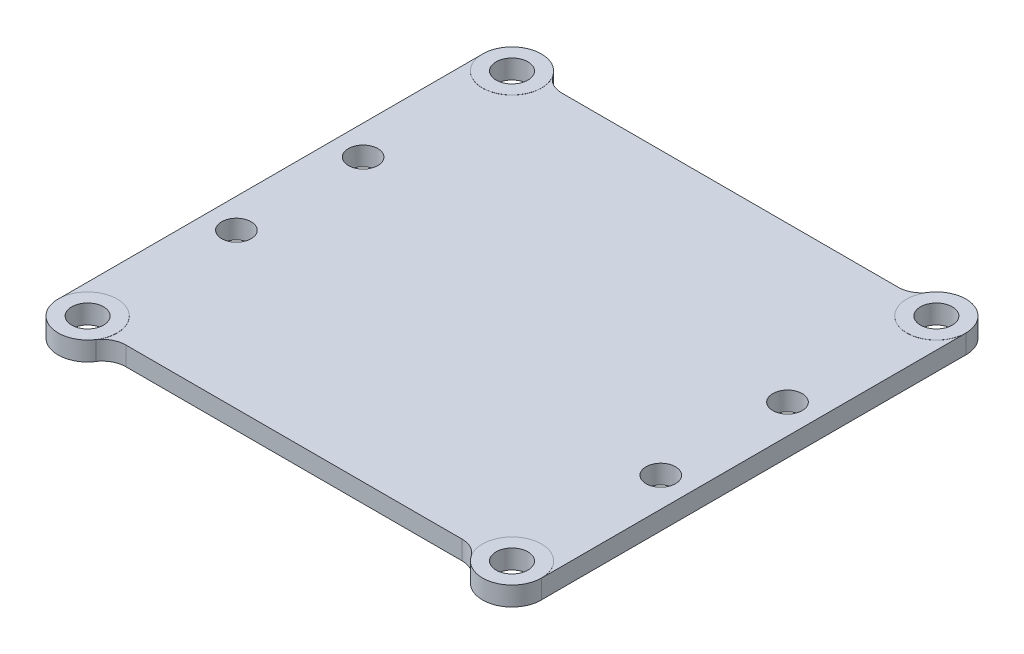
ISO-10303-21;
HEADER;
FILE_DESCRIPTION(('STEP AP214'),'2;1');
FILE_NAME('part.step','',(''),(''),'','','');
FILE_SCHEMA(('AUTOMOTIVE_DESIGN { 1 0 10303 214 1 1 1 1 }'));
ENDSEC;
DATA;
#1=APPLICATION_CONTEXT('core data for automotive mechanical design processes');
#2=APPLICATION_PROTOCOL_DEFINITION('international standard','automotive_design',2000,#1);
#3=PRODUCT_CONTEXT('',#1,'mechanical');
#4=PRODUCT('Part','Part','',(#3));
#5=PRODUCT_RELATED_PRODUCT_CATEGORY('part','',(#4));
#6=PRODUCT_DEFINITION_FORMATION('','',#4);
#7=PRODUCT_DEFINITION_CONTEXT('part definition',#1,'design');
#8=PRODUCT_DEFINITION('design','',#6,#7);
#9=PRODUCT_DEFINITION_SHAPE('','',#8);
#10=(LENGTH_UNIT() NAMED_UNIT(*) SI_UNIT(.MILLI.,.METRE.));
#11=(NAMED_UNIT(*) PLANE_ANGLE_UNIT() SI_UNIT($,.RADIAN.));
#12=(NAMED_UNIT(*) SI_UNIT($,.STERADIAN.) SOLID_ANGLE_UNIT());
#13=UNCERTAINTY_MEASURE_WITH_UNIT(LENGTH_MEASURE(1.E-05),#10,'distance_accuracy_value','');
#14=(GEOMETRIC_REPRESENTATION_CONTEXT(3) GLOBAL_UNCERTAINTY_ASSIGNED_CONTEXT((#13)) GLOBAL_UNIT_ASSIGNED_CONTEXT((#10,
#11,#12)) REPRESENTATION_CONTEXT('',''));
#15=CARTESIAN_POINT('',(0.,0.,0.));
#16=DIRECTION('',(0.,0.,1.));
#17=DIRECTION('',(1.,0.,0.));
#18=AXIS2_PLACEMENT_3D('',#15,#16,#17);
#19=CARTESIAN_POINT('',(0.,1.61,0.));
#20=DIRECTION('',(0.,1.,0.));
#21=DIRECTION('',(0.,0.,1.));
#22=AXIS2_PLACEMENT_3D('',#19,#20,#21);
#23=PLANE('',#22);
#24=CARTESIAN_POINT('',(-18.,1.61,18.));
#25=DIRECTION('',(0.,1.,0.));
#26=DIRECTION('',(0.,0.,1.));
#27=AXIS2_PLACEMENT_3D('',#24,#25,#26);
#28=CIRCLE('',#27,1.35);
#29=CARTESIAN_POINT('',(-18.,1.61,19.35));
#30=VERTEX_POINT('',#29);
#31=EDGE_CURVE('E239',#30,#30,#28,.F.);
#32=ORIENTED_EDGE('',*,*,#31,.T.);
#33=EDGE_LOOP('',(#32));
#34=FACE_BOUND('',#33,.T.);
#35=CARTESIAN_POINT('',(-18.,1.61,18.));
#36=DIRECTION('',(0.,1.,0.));
#37=DIRECTION('',(0.,0.,1.));
#38=AXIS2_PLACEMENT_3D('',#35,#36,#37);
#39=CIRCLE('',#38,2.5);
#40=CARTESIAN_POINT('',(-18.,1.61,20.5));
#41=VERTEX_POINT('',#40);
#42=EDGE_CURVE('E230',#41,#41,#39,.F.);
#43=ORIENTED_EDGE('',*,*,#42,.F.);
#44=EDGE_LOOP('',(#43));
#45=FACE_BOUND('',#44,.T.);
#46=ADVANCED_FACE('F17',(#34,#45),#23,.T.);
#47=CARTESIAN_POINT('',(0.,1.61,0.));
#48=DIRECTION('',(0.,1.,0.));
#49=DIRECTION('',(0.,0.,1.));
#50=AXIS2_PLACEMENT_3D('',#47,#48,#49);
#51=PLANE('',#50);
#52=CARTESIAN_POINT('',(18.,1.61,18.));
#53=DIRECTION('',(0.,1.,0.));
#54=DIRECTION('',(0.,0.,1.));
#55=AXIS2_PLACEMENT_3D('',#52,#53,#54);
#56=CIRCLE('',#55,1.35);
#57=CARTESIAN_POINT('',(18.,1.61,19.35));
#58=VERTEX_POINT('',#57);
#59=EDGE_CURVE('E237',#58,#58,#56,.F.);
#60=ORIENTED_EDGE('',*,*,#59,.T.);
#61=EDGE_LOOP('',(#60));
#62=FACE_BOUND('',#61,.T.);
#63=CARTESIAN_POINT('',(18.,1.61,18.));
#64=DIRECTION('',(0.,1.,0.));
#65=DIRECTION('',(0.,0.,1.));
#66=AXIS2_PLACEMENT_3D('',#63,#64,#65);
#67=CIRCLE('',#66,2.5);
#68=CARTESIAN_POINT('',(18.,1.61,20.5));
#69=VERTEX_POINT('',#68);
#70=EDGE_CURVE('E225',#69,#69,#67,.F.);
#71=ORIENTED_EDGE('',*,*,#70,.F.);
#72=EDGE_LOOP('',(#71));
#73=FACE_BOUND('',#72,.T.);
#74=ADVANCED_FACE('F281',(#62,#73),#51,.T.);
#75=CARTESIAN_POINT('',(0.,1.61,0.));
#76=DIRECTION('',(0.,1.,0.));
#77=DIRECTION('',(0.,0.,1.));
#78=AXIS2_PLACEMENT_3D('',#75,#76,#77);
#79=PLANE('',#78);
#80=CARTESIAN_POINT('',(18.,1.61,-18.));
#81=DIRECTION('',(0.,1.,0.));
#82=DIRECTION('',(0.,0.,1.));
#83=AXIS2_PLACEMENT_3D('',#80,#81,#82);
#84=CIRCLE('',#83,1.35);
#85=CARTESIAN_POINT('',(18.,1.61,-16.65));
#86=VERTEX_POINT('',#85);
#87=EDGE_CURVE('E234',#86,#86,#84,.F.);
#88=ORIENTED_EDGE('',*,*,#87,.T.);
#89=EDGE_LOOP('',(#88));
#90=FACE_BOUND('',#89,.T.);
#91=CARTESIAN_POINT('',(18.,1.61,-18.));
#92=DIRECTION('',(0.,-1.,0.));
#93=DIRECTION('',(0.,0.,-1.));
#94=AXIS2_PLACEMENT_3D('',#91,#92,#93);
#95=CIRCLE('',#94,2.5);
#96=CARTESIAN_POINT('',(18.,1.61,-20.5));
#97=VERTEX_POINT('',#96);
#98=EDGE_CURVE('E120',#97,#97,#95,.T.);
#99=ORIENTED_EDGE('',*,*,#98,.F.);
#100=EDGE_LOOP('',(#99));
#101=FACE_BOUND('',#100,.T.);
#102=ADVANCED_FACE('F275',(#90,#101),#79,.T.);
#103=CARTESIAN_POINT('',(0.,1.61,0.));
#104=DIRECTION('',(0.,1.,0.));
#105=DIRECTION('',(0.,0.,1.));
#106=AXIS2_PLACEMENT_3D('',#103,#104,#105);
#107=PLANE('',#106);
#108=CARTESIAN_POINT('',(-18.,1.61,-18.));
#109=DIRECTION('',(0.,1.,0.));
#110=DIRECTION('',(0.,0.,1.));
#111=AXIS2_PLACEMENT_3D('',#108,#109,#110);
#112=CIRCLE('',#111,1.35);
#113=CARTESIAN_POINT('',(-18.,1.61,-16.65));
#114=VERTEX_POINT('',#113);
#115=EDGE_CURVE('E20',#114,#114,#112,.F.);
#116=ORIENTED_EDGE('',*,*,#115,.T.);
#117=EDGE_LOOP('',(#116));
#118=FACE_BOUND('',#117,.T.);
#119=CARTESIAN_POINT('',(-18.,1.61,-18.));
#120=DIRECTION('',(0.,1.,0.));
#121=DIRECTION('',(0.,0.,1.));
#122=AXIS2_PLACEMENT_3D('',#119,#120,#121);
#123=CIRCLE('',#122,2.5);
#124=CARTESIAN_POINT('',(-18.,1.61,-15.5));
#125=VERTEX_POINT('',#124);
#126=EDGE_CURVE('E219',#125,#125,#123,.F.);
#127=ORIENTED_EDGE('',*,*,#126,.F.);
#128=EDGE_LOOP('',(#127));
#129=FACE_BOUND('',#128,.T.);
#130=ADVANCED_FACE('F246',(#118,#129),#107,.T.);
#131=CARTESIAN_POINT('',(-18.,1.6,-18.));
#132=DIRECTION('',(0.,1.,0.));
#133=DIRECTION('',(0.,0.,1.));
#134=AXIS2_PLACEMENT_3D('',#131,#132,#133);
#135=CYLINDRICAL_SURFACE('',#134,1.35);
#136=ORIENTED_EDGE('',*,*,#115,.F.);
#137=EDGE_LOOP('',(#136));
#138=FACE_BOUND('',#137,.T.);
#139=CARTESIAN_POINT('',(-18.,-0.01,-18.));
#140=DIRECTION('',(0.,1.,0.));
#141=DIRECTION('',(0.,0.,1.));
#142=AXIS2_PLACEMENT_3D('',#139,#140,#141);
#143=CIRCLE('',#142,1.35);
#144=CARTESIAN_POINT('',(-18.,-0.01,-16.65));
#145=VERTEX_POINT('',#144);
#146=EDGE_CURVE('E215',#145,#145,#143,.T.);
#147=ORIENTED_EDGE('',*,*,#146,.F.);
#148=EDGE_LOOP('',(#147));
#149=FACE_BOUND('',#148,.T.);
#150=ADVANCED_FACE('F249',(#138,#149),#135,.F.);
#151=CARTESIAN_POINT('',(-18.,1.6,18.));
#152=DIRECTION('',(0.,1.,0.));
#153=DIRECTION('',(0.,0.,1.));
#154=AXIS2_PLACEMENT_3D('',#151,#152,#153);
#155=CYLINDRICAL_SURFACE('',#154,1.35);
#156=ORIENTED_EDGE('',*,*,#31,.F.);
#157=EDGE_LOOP('',(#156));
#158=FACE_BOUND('',#157,.T.);
#159=CARTESIAN_POINT('',(-18.,-0.01,18.));
#160=DIRECTION('',(0.,1.,0.));
#161=DIRECTION('',(0.,0.,1.));
#162=AXIS2_PLACEMENT_3D('',#159,#160,#161);
#163=CIRCLE('',#162,1.35);
#164=CARTESIAN_POINT('',(-18.,-0.01,19.35));
#165=VERTEX_POINT('',#164);
#166=EDGE_CURVE('E212',#165,#165,#163,.T.);
#167=ORIENTED_EDGE('',*,*,#166,.F.);
#168=EDGE_LOOP('',(#167));
#169=FACE_BOUND('',#168,.T.);
#170=ADVANCED_FACE('F252',(#158,#169),#155,.F.);
#171=CARTESIAN_POINT('',(18.,1.6,18.));
#172=DIRECTION('',(0.,1.,0.));
#173=DIRECTION('',(0.,0.,1.));
#174=AXIS2_PLACEMENT_3D('',#171,#172,#173);
#175=CYLINDRICAL_SURFACE('',#174,1.35);
#176=ORIENTED_EDGE('',*,*,#59,.F.);
#177=EDGE_LOOP('',(#176));
#178=FACE_BOUND('',#177,.T.);
#179=CARTESIAN_POINT('',(18.,-0.01,18.));
#180=DIRECTION('',(0.,1.,0.));
#181=DIRECTION('',(0.,0.,1.));
#182=AXIS2_PLACEMENT_3D('',#179,#180,#181);
#183=CIRCLE('',#182,1.35);
#184=CARTESIAN_POINT('',(18.,-0.01,19.35));
#185=VERTEX_POINT('',#184);
#186=EDGE_CURVE('E209',#185,#185,#183,.T.);
#187=ORIENTED_EDGE('',*,*,#186,.F.);
#188=EDGE_LOOP('',(#187));
#189=FACE_BOUND('',#188,.T.);
#190=ADVANCED_FACE('F363',(#178,#189),#175,.F.);
#191=CARTESIAN_POINT('',(18.,1.6,-18.));
#192=DIRECTION('',(0.,1.,0.));
#193=DIRECTION('',(0.,0.,1.));
#194=AXIS2_PLACEMENT_3D('',#191,#192,#193);
#195=CYLINDRICAL_SURFACE('',#194,1.35);
#196=ORIENTED_EDGE('',*,*,#87,.F.);
#197=EDGE_LOOP('',(#196));
#198=FACE_BOUND('',#197,.T.);
#199=CARTESIAN_POINT('',(18.,-0.01,-18.));
#200=DIRECTION('',(0.,1.,0.));
#201=DIRECTION('',(0.,0.,1.));
#202=AXIS2_PLACEMENT_3D('',#199,#200,#201);
#203=CIRCLE('',#202,1.35);
#204=CARTESIAN_POINT('',(18.,-0.01,-16.65));
#205=VERTEX_POINT('',#204);
#206=EDGE_CURVE('E206',#205,#205,#203,.T.);
#207=ORIENTED_EDGE('',*,*,#206,.F.);
#208=EDGE_LOOP('',(#207));
#209=FACE_BOUND('',#208,.T.);
#210=ADVANCED_FACE('F260',(#198,#209),#195,.F.);
#211=CARTESIAN_POINT('',(0.,-0.01,0.));
#212=DIRECTION('',(0.,-1.,0.));
#213=DIRECTION('',(0.,0.,-1.));
#214=AXIS2_PLACEMENT_3D('',#211,#212,#213);
#215=PLANE('',#214);
#216=ORIENTED_EDGE('',*,*,#146,.T.);
#217=EDGE_LOOP('',(#216));
#218=FACE_BOUND('',#217,.T.);
#219=CARTESIAN_POINT('',(-18.,-0.01,-18.));
#220=DIRECTION('',(0.,-1.,0.));
#221=DIRECTION('',(0.,0.,-1.));
#222=AXIS2_PLACEMENT_3D('',#219,#220,#221);
#223=CIRCLE('',#222,2.5);
#224=CARTESIAN_POINT('',(-18.,-0.01,-20.5));
#225=VERTEX_POINT('',#224);
#226=EDGE_CURVE('E187',#225,#225,#223,.F.);
#227=ORIENTED_EDGE('',*,*,#226,.F.);
#228=EDGE_LOOP('',(#227));
#229=FACE_BOUND('',#228,.T.);
#230=ADVANCED_FACE('F256',(#218,#229),#215,.T.);
#231=CARTESIAN_POINT('',(0.,-0.01,0.));
#232=DIRECTION('',(0.,-1.,0.));
#233=DIRECTION('',(0.,0.,-1.));
#234=AXIS2_PLACEMENT_3D('',#231,#232,#233);
#235=PLANE('',#234);
#236=ORIENTED_EDGE('',*,*,#166,.T.);
#237=EDGE_LOOP('',(#236));
#238=FACE_BOUND('',#237,.T.);
#239=CARTESIAN_POINT('',(-18.,-0.01,18.));
#240=DIRECTION('',(0.,1.,0.));
#241=DIRECTION('',(0.,0.,1.));
#242=AXIS2_PLACEMENT_3D('',#239,#240,#241);
#243=CIRCLE('',#242,2.5);
#244=CARTESIAN_POINT('',(-18.,-0.01,20.5));
#245=VERTEX_POINT('',#244);
#246=EDGE_CURVE('E183',#245,#245,#243,.T.);
#247=ORIENTED_EDGE('',*,*,#246,.F.);
#248=EDGE_LOOP('',(#247));
#249=FACE_BOUND('',#248,.T.);
#250=ADVANCED_FACE('F259',(#238,#249),#235,.T.);
#251=CARTESIAN_POINT('',(0.,-0.01,0.));
#252=DIRECTION('',(0.,-1.,0.));
#253=DIRECTION('',(0.,0.,-1.));
#254=AXIS2_PLACEMENT_3D('',#251,#252,#253);
#255=PLANE('',#254);
#256=ORIENTED_EDGE('',*,*,#186,.T.);
#257=EDGE_LOOP('',(#256));
#258=FACE_BOUND('',#257,.T.);
#259=CARTESIAN_POINT('',(18.,-0.01,18.));
#260=DIRECTION('',(0.,1.,0.));
#261=DIRECTION('',(0.,0.,1.));
#262=AXIS2_PLACEMENT_3D('',#259,#260,#261);
#263=CIRCLE('',#262,2.5);
#264=CARTESIAN_POINT('',(18.,-0.01,20.5));
#265=VERTEX_POINT('',#264);
#266=EDGE_CURVE('E174',#265,#265,#263,.T.);
#267=ORIENTED_EDGE('',*,*,#266,.F.);
#268=EDGE_LOOP('',(#267));
#269=FACE_BOUND('',#268,.T.);
#270=ADVANCED_FACE('F353',(#258,#269),#255,.T.);
#271=CARTESIAN_POINT('',(0.,-0.01,0.));
#272=DIRECTION('',(0.,-1.,0.));
#273=DIRECTION('',(0.,0.,-1.));
#274=AXIS2_PLACEMENT_3D('',#271,#272,#273);
#275=PLANE('',#274);
#276=ORIENTED_EDGE('',*,*,#206,.T.);
#277=EDGE_LOOP('',(#276));
#278=FACE_BOUND('',#277,.T.);
#279=CARTESIAN_POINT('',(18.,-0.01,-18.));
#280=DIRECTION('',(0.,-1.,0.));
#281=DIRECTION('',(0.,0.,-1.));
#282=AXIS2_PLACEMENT_3D('',#279,#280,#281);
#283=CIRCLE('',#282,2.5);
#284=CARTESIAN_POINT('',(18.,-0.01,-20.5));
#285=VERTEX_POINT('',#284);
#286=EDGE_CURVE('E170',#285,#285,#283,.F.);
#287=ORIENTED_EDGE('',*,*,#286,.F.);
#288=EDGE_LOOP('',(#287));
#289=FACE_BOUND('',#288,.T.);
#290=ADVANCED_FACE('F349',(#278,#289),#275,.T.);
#291=CARTESIAN_POINT('',(0.,1.6,0.));
#292=DIRECTION('',(0.,1.,0.));
#293=DIRECTION('',(0.,0.,1.));
#294=AXIS2_PLACEMENT_3D('',#291,#292,#293);
#295=PLANE('',#294);
#296=CARTESIAN_POINT('',(18.,1.6,-5.37));
#297=DIRECTION('',(0.,-1.,0.));
#298=DIRECTION('',(0.,0.,-1.));
#299=AXIS2_PLACEMENT_3D('',#296,#297,#298);
#300=CIRCLE('',#299,1.25);
#301=CARTESIAN_POINT('',(18.,1.6,-6.62));
#302=VERTEX_POINT('',#301);
#303=EDGE_CURVE('E158',#302,#302,#300,.T.);
#304=ORIENTED_EDGE('',*,*,#303,.T.);
#305=EDGE_LOOP('',(#304));
#306=FACE_BOUND('',#305,.T.);
#307=CARTESIAN_POINT('',(-18.,1.6,5.38));
#308=DIRECTION('',(0.,-1.,0.));
#309=DIRECTION('',(0.,0.,-1.));
#310=AXIS2_PLACEMENT_3D('',#307,#308,#309);
#311=CIRCLE('',#310,1.25);
#312=CARTESIAN_POINT('',(-18.,1.6,4.13));
#313=VERTEX_POINT('',#312);
#314=EDGE_CURVE('E161',#313,#313,#311,.T.);
#315=ORIENTED_EDGE('',*,*,#314,.T.);
#316=EDGE_LOOP('',(#315));
#317=FACE_BOUND('',#316,.T.);
#318=CARTESIAN_POINT('',(-18.,1.6,-5.37));
#319=DIRECTION('',(0.,-1.,0.));
#320=DIRECTION('',(0.,0.,-1.));
#321=AXIS2_PLACEMENT_3D('',#318,#319,#320);
#322=CIRCLE('',#321,1.25);
#323=CARTESIAN_POINT('',(-18.,1.6,-6.62));
#324=VERTEX_POINT('',#323);
#325=EDGE_CURVE('E164',#324,#324,#322,.T.);
#326=ORIENTED_EDGE('',*,*,#325,.T.);
#327=EDGE_LOOP('',(#326));
#328=FACE_BOUND('',#327,.T.);
#329=CARTESIAN_POINT('',(18.,1.6,5.38));
#330=DIRECTION('',(0.,-1.,0.));
#331=DIRECTION('',(0.,0.,-1.));
#332=AXIS2_PLACEMENT_3D('',#329,#330,#331);
#333=CIRCLE('',#332,1.25);
#334=CARTESIAN_POINT('',(18.,1.6,4.13));
#335=VERTEX_POINT('',#334);
#336=EDGE_CURVE('E167',#335,#335,#333,.T.);
#337=ORIENTED_EDGE('',*,*,#336,.T.);
#338=EDGE_LOOP('',(#337));
#339=FACE_BOUND('',#338,.T.);
#340=CARTESIAN_POINT('',(-14.25834261323,1.6,-20.5));
#341=DIRECTION('',(0.,-1.,0.));
#342=DIRECTION('',(0.,0.,-1.));
#343=AXIS2_PLACEMENT_3D('',#340,#341,#342);
#344=CIRCLE('',#343,2.);
#345=CARTESIAN_POINT('',(-14.25834261323,1.6,-18.5));
#346=VERTEX_POINT('',#345);
#347=CARTESIAN_POINT('',(-15.9213014517933,1.6,-19.3888888888888));
#348=VERTEX_POINT('',#347);
#349=EDGE_CURVE('E190',#346,#348,#344,.T.);
#350=ORIENTED_EDGE('',*,*,#349,.T.);
#351=CARTESIAN_POINT('',(-18.,1.6,-18.));
#352=DIRECTION('',(0.,1.,0.));
#353=DIRECTION('',(0.,0.,1.));
#354=AXIS2_PLACEMENT_3D('',#351,#352,#353);
#355=CIRCLE('',#354,2.5);
#356=CARTESIAN_POINT('',(-20.5,1.6,-18.));
#357=VERTEX_POINT('',#356);
#358=EDGE_CURVE('E197',#348,#357,#355,.F.);
#359=ORIENTED_EDGE('',*,*,#358,.T.);
#360=DIRECTION('',(0.,0.,1.));
#361=VECTOR('',#360,1.);
#362=CARTESIAN_POINT('',(-20.5,1.6,-20.5));
#363=LINE('',#362,#361);
#364=CARTESIAN_POINT('',(-20.5,1.6,18.));
#365=VERTEX_POINT('',#364);
#366=EDGE_CURVE('E186',#365,#357,#363,.F.);
#367=ORIENTED_EDGE('',*,*,#366,.F.);
#368=CARTESIAN_POINT('',(-18.,1.6,18.));
#369=DIRECTION('',(0.,1.,0.));
#370=DIRECTION('',(0.,0.,1.));
#371=AXIS2_PLACEMENT_3D('',#368,#369,#370);
#372=CIRCLE('',#371,2.5);
#373=CARTESIAN_POINT('',(-15.9213014517933,1.6,19.3888888888888));
#374=VERTEX_POINT('',#373);
#375=EDGE_CURVE('E203',#365,#374,#372,.F.);
#376=ORIENTED_EDGE('',*,*,#375,.T.);
#377=CARTESIAN_POINT('',(-14.25834261323,1.6,20.5));
#378=DIRECTION('',(0.,1.,0.));
#379=DIRECTION('',(0.,0.,1.));
#380=AXIS2_PLACEMENT_3D('',#377,#378,#379);
#381=CIRCLE('',#380,2.);
#382=CARTESIAN_POINT('',(-14.25834261323,1.6,18.5));
#383=VERTEX_POINT('',#382);
#384=EDGE_CURVE('E180',#374,#383,#381,.F.);
#385=ORIENTED_EDGE('',*,*,#384,.T.);
#386=DIRECTION('',(-1.,0.,0.));
#387=VECTOR('',#386,1.);
#388=CARTESIAN_POINT('',(16.375,1.6,18.5));
#389=LINE('',#388,#387);
#390=CARTESIAN_POINT('',(14.25834261323,1.6,18.5));
#391=VERTEX_POINT('',#390);
#392=EDGE_CURVE('E416',#383,#391,#389,.F.);
#393=ORIENTED_EDGE('',*,*,#392,.T.);
#394=CARTESIAN_POINT('',(14.25834261323,1.6,20.5));
#395=DIRECTION('',(0.,-1.,0.));
#396=DIRECTION('',(0.,0.,-1.));
#397=AXIS2_PLACEMENT_3D('',#394,#395,#396);
#398=CIRCLE('',#397,2.);
#399=CARTESIAN_POINT('',(15.9213014517933,1.6,19.3888888888888));
#400=VERTEX_POINT('',#399);
#401=EDGE_CURVE('E177',#391,#400,#398,.T.);
#402=ORIENTED_EDGE('',*,*,#401,.T.);
#403=CARTESIAN_POINT('',(18.,1.6,18.));
#404=DIRECTION('',(0.,1.,0.));
#405=DIRECTION('',(0.,0.,1.));
#406=AXIS2_PLACEMENT_3D('',#403,#404,#405);
#407=CIRCLE('',#406,2.5);
#408=CARTESIAN_POINT('',(20.5,1.6,18.));
#409=VERTEX_POINT('',#408);
#410=EDGE_CURVE('E200',#400,#409,#407,.F.);
#411=ORIENTED_EDGE('',*,*,#410,.T.);
#412=DIRECTION('',(0.,0.,-1.));
#413=VECTOR('',#412,1.);
#414=CARTESIAN_POINT('',(20.5,1.6,20.5));
#415=LINE('',#414,#413);
#416=CARTESIAN_POINT('',(20.5,1.6,-18.));
#417=VERTEX_POINT('',#416);
#418=EDGE_CURVE('E173',#417,#409,#415,.F.);
#419=ORIENTED_EDGE('',*,*,#418,.F.);
#420=CARTESIAN_POINT('',(18.,1.6,-18.));
#421=DIRECTION('',(0.,-1.,0.));
#422=DIRECTION('',(0.,0.,-1.));
#423=AXIS2_PLACEMENT_3D('',#420,#421,#422);
#424=CIRCLE('',#423,2.5);
#425=CARTESIAN_POINT('',(15.9213014517933,1.6,-19.3888888888888));
#426=VERTEX_POINT('',#425);
#427=EDGE_CURVE('E116',#417,#426,#424,.T.);
#428=ORIENTED_EDGE('',*,*,#427,.T.);
#429=CARTESIAN_POINT('',(14.25834261323,1.6,-20.5));
#430=DIRECTION('',(0.,1.,0.));
#431=DIRECTION('',(0.,0.,1.));
#432=AXIS2_PLACEMENT_3D('',#429,#430,#431);
#433=CIRCLE('',#432,2.);
#434=CARTESIAN_POINT('',(14.25834261323,1.6,-18.5));
#435=VERTEX_POINT('',#434);
#436=EDGE_CURVE('E194',#426,#435,#433,.F.);
#437=ORIENTED_EDGE('',*,*,#436,.T.);
#438=DIRECTION('',(1.,0.,0.));
#439=VECTOR('',#438,1.);
#440=CARTESIAN_POINT('',(-16.375,1.6,-18.5));
#441=LINE('',#440,#439);
#442=EDGE_CURVE('E419',#435,#346,#441,.F.);
#443=ORIENTED_EDGE('',*,*,#442,.T.);
#444=EDGE_LOOP('',(#350,#359,#367,#376,#385,#393,#402,#411,#419,#428,#437,#443));
#445=FACE_BOUND('',#444,.T.);
#446=ADVANCED_FACE('F345',(#306,#317,#328,#339,#445),#295,.T.);
#447=CARTESIAN_POINT('',(14.25834261323,-2.577732,-20.5));
#448=DIRECTION('',(0.,1.,0.));
#449=DIRECTION('',(0.,0.,1.));
#450=AXIS2_PLACEMENT_3D('',#447,#448,#449);
#451=CYLINDRICAL_SURFACE('',#450,2.);
#452=DIRECTION('',(0.,1.,0.));
#453=VECTOR('',#452,1.);
#454=CARTESIAN_POINT('',(14.25834261323,1.6,-18.5));
#455=LINE('',#454,#453);
#456=CARTESIAN_POINT('',(14.25834261323,0.,-18.5));
#457=VERTEX_POINT('',#456);
#458=EDGE_CURVE('E196',#457,#435,#455,.T.);
#459=ORIENTED_EDGE('',*,*,#458,.T.);
#460=ORIENTED_EDGE('',*,*,#436,.F.);
#461=DIRECTION('',(0.,1.,0.));
#462=VECTOR('',#461,1.);
#463=CARTESIAN_POINT('',(15.9213014517921,1.6,-19.3888888888886));
#464=LINE('',#463,#462);
#465=CARTESIAN_POINT('',(15.9213014517933,0.,-19.3888888888888));
#466=VERTEX_POINT('',#465);
#467=EDGE_CURVE('E121',#466,#426,#464,.T.);
#468=ORIENTED_EDGE('',*,*,#467,.F.);
#469=CARTESIAN_POINT('',(14.25834261323,0.,-20.5));
#470=DIRECTION('',(0.,1.,0.));
#471=DIRECTION('',(0.,0.,1.));
#472=AXIS2_PLACEMENT_3D('',#469,#470,#471);
#473=CIRCLE('',#472,2.);
#474=EDGE_CURVE('E131',#466,#457,#473,.F.);
#475=ORIENTED_EDGE('',*,*,#474,.T.);
#476=EDGE_LOOP('',(#459,#460,#468,#475));
#477=FACE_BOUND('',#476,.T.);
#478=ADVANCED_FACE('F341',(#477),#451,.F.);
#479=CARTESIAN_POINT('',(-16.375,1.6,-18.5));
#480=DIRECTION('',(0.,0.,1.));
#481=DIRECTION('',(1.,0.,0.));
#482=AXIS2_PLACEMENT_3D('',#479,#480,#481);
#483=PLANE('',#482);
#484=ORIENTED_EDGE('',*,*,#458,.F.);
#485=DIRECTION('',(1.,0.,0.));
#486=VECTOR('',#485,1.);
#487=CARTESIAN_POINT('',(0.,0.,-18.5));
#488=LINE('',#487,#486);
#489=CARTESIAN_POINT('',(-14.25834261323,0.,-18.5));
#490=VERTEX_POINT('',#489);
#491=EDGE_CURVE('E156',#457,#490,#488,.F.);
#492=ORIENTED_EDGE('',*,*,#491,.T.);
#493=DIRECTION('',(0.,-1.,0.));
#494=VECTOR('',#493,1.);
#495=CARTESIAN_POINT('',(-14.25834261323,4.167732,-18.5));
#496=LINE('',#495,#494);
#497=EDGE_CURVE('E193',#490,#346,#496,.F.);
#498=ORIENTED_EDGE('',*,*,#497,.T.);
#499=ORIENTED_EDGE('',*,*,#442,.F.);
#500=EDGE_LOOP('',(#484,#492,#498,#499));
#501=FACE_BOUND('',#500,.T.);
#502=ADVANCED_FACE('F337',(#501),#483,.F.);
#503=CARTESIAN_POINT('',(-14.25834261323,4.167732,-20.5));
#504=DIRECTION('',(0.,-1.,0.));
#505=DIRECTION('',(0.,0.,-1.));
#506=AXIS2_PLACEMENT_3D('',#503,#504,#505);
#507=CYLINDRICAL_SURFACE('',#506,2.);
#508=ORIENTED_EDGE('',*,*,#497,.F.);
#509=CARTESIAN_POINT('',(-14.25834261323,0.,-20.5));
#510=DIRECTION('',(0.,-1.,0.));
#511=DIRECTION('',(0.,0.,-1.));
#512=AXIS2_PLACEMENT_3D('',#509,#510,#511);
#513=CIRCLE('',#512,2.);
#514=CARTESIAN_POINT('',(-15.9213014517933,0.,-19.3888888888888));
#515=VERTEX_POINT('',#514);
#516=EDGE_CURVE('E153',#490,#515,#513,.T.);
#517=ORIENTED_EDGE('',*,*,#516,.T.);
#518=DIRECTION('',(0.,1.,0.));
#519=VECTOR('',#518,1.);
#520=CARTESIAN_POINT('',(-15.9213014517921,1.6,-19.3888888888886));
#521=LINE('',#520,#519);
#522=EDGE_CURVE('E218',#348,#515,#521,.F.);
#523=ORIENTED_EDGE('',*,*,#522,.F.);
#524=ORIENTED_EDGE('',*,*,#349,.F.);
#525=EDGE_LOOP('',(#508,#517,#523,#524));
#526=FACE_BOUND('',#525,.T.);
#527=ADVANCED_FACE('F268',(#526),#507,.F.);
#528=CARTESIAN_POINT('',(-18.,0.,-18.));
#529=DIRECTION('',(0.,-1.,0.));
#530=DIRECTION('',(0.,0.,-1.));
#531=AXIS2_PLACEMENT_3D('',#528,#529,#530);
#532=CYLINDRICAL_SURFACE('',#531,2.5);
#533=ORIENTED_EDGE('',*,*,#226,.T.);
#534=EDGE_LOOP('',(#533));
#535=FACE_BOUND('',#534,.T.);
#536=ORIENTED_EDGE('',*,*,#522,.T.);
#537=CARTESIAN_POINT('',(-18.,0.,-18.));
#538=DIRECTION('',(0.,-1.,0.));
#539=DIRECTION('',(0.,0.,-1.));
#540=AXIS2_PLACEMENT_3D('',#537,#538,#539);
#541=CIRCLE('',#540,2.5);
#542=CARTESIAN_POINT('',(-20.5,0.,-18.));
#543=VERTEX_POINT('',#542);
#544=EDGE_CURVE('E151',#515,#543,#541,.T.);
#545=ORIENTED_EDGE('',*,*,#544,.T.);
#546=DIRECTION('',(0.,1.,0.));
#547=VECTOR('',#546,1.);
#548=CARTESIAN_POINT('',(-20.5,1.6,-18.));
#549=LINE('',#548,#547);
#550=EDGE_CURVE('E222',#543,#357,#549,.T.);
#551=ORIENTED_EDGE('',*,*,#550,.T.);
#552=ORIENTED_EDGE('',*,*,#358,.F.);
#553=EDGE_LOOP('',(#536,#545,#551,#552));
#554=FACE_BOUND('',#553,.T.);
#555=ORIENTED_EDGE('',*,*,#126,.T.);
#556=EDGE_LOOP('',(#555));
#557=FACE_BOUND('',#556,.T.);
#558=ADVANCED_FACE('F264',(#535,#554,#557),#532,.T.);
#559=CARTESIAN_POINT('',(-20.5,0.,-20.5));
#560=DIRECTION('',(-1.,0.,0.));
#561=DIRECTION('',(0.,0.,1.));
#562=AXIS2_PLACEMENT_3D('',#559,#560,#561);
#563=PLANE('',#562);
#564=DIRECTION('',(0.,1.,0.));
#565=VECTOR('',#564,1.);
#566=CARTESIAN_POINT('',(-20.5,1.6,18.));
#567=LINE('',#566,#565);
#568=CARTESIAN_POINT('',(-20.5,0.,18.));
#569=VERTEX_POINT('',#568);
#570=EDGE_CURVE('E233',#365,#569,#567,.F.);
#571=ORIENTED_EDGE('',*,*,#570,.F.);
#572=ORIENTED_EDGE('',*,*,#366,.T.);
#573=ORIENTED_EDGE('',*,*,#550,.F.);
#574=DIRECTION('',(0.,0.,1.));
#575=VECTOR('',#574,1.);
#576=CARTESIAN_POINT('',(-20.5,0.,0.));
#577=LINE('',#576,#575);
#578=EDGE_CURVE('E150',#543,#569,#577,.T.);
#579=ORIENTED_EDGE('',*,*,#578,.T.);
#580=EDGE_LOOP('',(#571,#572,#573,#579));
#581=FACE_BOUND('',#580,.T.);
#582=ADVANCED_FACE('F267',(#581),#563,.T.);
#583=CARTESIAN_POINT('',(-18.,1.6,18.));
#584=DIRECTION('',(0.,1.,0.));
#585=DIRECTION('',(0.,0.,1.));
#586=AXIS2_PLACEMENT_3D('',#583,#584,#585);
#587=CYLINDRICAL_SURFACE('',#586,2.5);
#588=ORIENTED_EDGE('',*,*,#42,.T.);
#589=EDGE_LOOP('',(#588));
#590=FACE_BOUND('',#589,.T.);
#591=ORIENTED_EDGE('',*,*,#246,.T.);
#592=EDGE_LOOP('',(#591));
#593=FACE_BOUND('',#592,.T.);
#594=ORIENTED_EDGE('',*,*,#570,.T.);
#595=CARTESIAN_POINT('',(-18.,0.,18.));
#596=DIRECTION('',(0.,1.,0.));
#597=DIRECTION('',(0.,0.,1.));
#598=AXIS2_PLACEMENT_3D('',#595,#596,#597);
#599=CIRCLE('',#598,2.5);
#600=CARTESIAN_POINT('',(-15.9213014517933,0.,19.3888888888888));
#601=VERTEX_POINT('',#600);
#602=EDGE_CURVE('E147',#569,#601,#599,.F.);
#603=ORIENTED_EDGE('',*,*,#602,.T.);
#604=DIRECTION('',(0.,1.,0.));
#605=VECTOR('',#604,1.);
#606=CARTESIAN_POINT('',(-15.9213014517921,1.6,19.3888888888886));
#607=LINE('',#606,#605);
#608=EDGE_CURVE('E229',#601,#374,#607,.T.);
#609=ORIENTED_EDGE('',*,*,#608,.T.);
#610=ORIENTED_EDGE('',*,*,#375,.F.);
#611=EDGE_LOOP('',(#594,#603,#609,#610));
#612=FACE_BOUND('',#611,.T.);
#613=ADVANCED_FACE('F327',(#590,#593,#612),#587,.T.);
#614=CARTESIAN_POINT('',(-14.25834261323,-2.577732,20.5));
#615=DIRECTION('',(0.,1.,0.));
#616=DIRECTION('',(0.,0.,1.));
#617=AXIS2_PLACEMENT_3D('',#614,#615,#616);
#618=CYLINDRICAL_SURFACE('',#617,2.);
#619=DIRECTION('',(0.,1.,0.));
#620=VECTOR('',#619,1.);
#621=CARTESIAN_POINT('',(-14.25834261323,1.6,18.5));
#622=LINE('',#621,#620);
#623=CARTESIAN_POINT('',(-14.25834261323,0.,18.5));
#624=VERTEX_POINT('',#623);
#625=EDGE_CURVE('E182',#624,#383,#622,.T.);
#626=ORIENTED_EDGE('',*,*,#625,.T.);
#627=ORIENTED_EDGE('',*,*,#384,.F.);
#628=ORIENTED_EDGE('',*,*,#608,.F.);
#629=CARTESIAN_POINT('',(-14.25834261323,0.,20.5));
#630=DIRECTION('',(0.,1.,0.));
#631=DIRECTION('',(0.,0.,1.));
#632=AXIS2_PLACEMENT_3D('',#629,#630,#631);
#633=CIRCLE('',#632,2.);
#634=EDGE_CURVE('E144',#601,#624,#633,.F.);
#635=ORIENTED_EDGE('',*,*,#634,.T.);
#636=EDGE_LOOP('',(#626,#627,#628,#635));
#637=FACE_BOUND('',#636,.T.);
#638=ADVANCED_FACE('F323',(#637),#618,.F.);
#639=CARTESIAN_POINT('',(16.375,1.6,18.5));
#640=DIRECTION('',(0.,0.,-1.));
#641=DIRECTION('',(-1.,0.,0.));
#642=AXIS2_PLACEMENT_3D('',#639,#640,#641);
#643=PLANE('',#642);
#644=ORIENTED_EDGE('',*,*,#625,.F.);
#645=DIRECTION('',(1.,0.,0.));
#646=VECTOR('',#645,1.);
#647=CARTESIAN_POINT('',(0.,0.,18.5));
#648=LINE('',#647,#646);
#649=CARTESIAN_POINT('',(14.25834261323,0.,18.5));
#650=VERTEX_POINT('',#649);
#651=EDGE_CURVE('E143',#624,#650,#648,.T.);
#652=ORIENTED_EDGE('',*,*,#651,.T.);
#653=DIRECTION('',(0.,-1.,0.));
#654=VECTOR('',#653,1.);
#655=CARTESIAN_POINT('',(14.25834261323,4.167732,18.5));
#656=LINE('',#655,#654);
#657=EDGE_CURVE('E35',#650,#391,#656,.F.);
#658=ORIENTED_EDGE('',*,*,#657,.T.);
#659=ORIENTED_EDGE('',*,*,#392,.F.);
#660=EDGE_LOOP('',(#644,#652,#658,#659));
#661=FACE_BOUND('',#660,.T.);
#662=ADVANCED_FACE('F320',(#661),#643,.F.);
#663=CARTESIAN_POINT('',(14.25834261323,4.167732,20.5));
#664=DIRECTION('',(0.,-1.,0.));
#665=DIRECTION('',(0.,0.,-1.));
#666=AXIS2_PLACEMENT_3D('',#663,#664,#665);
#667=CYLINDRICAL_SURFACE('',#666,2.);
#668=ORIENTED_EDGE('',*,*,#657,.F.);
#669=CARTESIAN_POINT('',(14.25834261323,0.,20.5));
#670=DIRECTION('',(0.,-1.,0.));
#671=DIRECTION('',(0.,0.,-1.));
#672=AXIS2_PLACEMENT_3D('',#669,#670,#671);
#673=CIRCLE('',#672,2.);
#674=CARTESIAN_POINT('',(15.9213014517933,0.,19.3888888888888));
#675=VERTEX_POINT('',#674);
#676=EDGE_CURVE('E141',#650,#675,#673,.T.);
#677=ORIENTED_EDGE('',*,*,#676,.T.);
#678=DIRECTION('',(0.,1.,0.));
#679=VECTOR('',#678,1.);
#680=CARTESIAN_POINT('',(15.9213014517921,1.6,19.3888888888886));
#681=LINE('',#680,#679);
#682=EDGE_CURVE('E228',#400,#675,#681,.F.);
#683=ORIENTED_EDGE('',*,*,#682,.F.);
#684=ORIENTED_EDGE('',*,*,#401,.F.);
#685=EDGE_LOOP('',(#668,#677,#683,#684));
#686=FACE_BOUND('',#685,.T.);
#687=ADVANCED_FACE('F316',(#686),#667,.F.);
#688=CARTESIAN_POINT('',(18.,1.6,18.));
#689=DIRECTION('',(0.,1.,0.));
#690=DIRECTION('',(0.,0.,1.));
#691=AXIS2_PLACEMENT_3D('',#688,#689,#690);
#692=CYLINDRICAL_SURFACE('',#691,2.5);
#693=ORIENTED_EDGE('',*,*,#70,.T.);
#694=EDGE_LOOP('',(#693));
#695=FACE_BOUND('',#694,.T.);
#696=ORIENTED_EDGE('',*,*,#266,.T.);
#697=EDGE_LOOP('',(#696));
#698=FACE_BOUND('',#697,.T.);
#699=ORIENTED_EDGE('',*,*,#682,.T.);
#700=CARTESIAN_POINT('',(18.,0.,18.));
#701=DIRECTION('',(0.,1.,0.));
#702=DIRECTION('',(0.,0.,1.));
#703=AXIS2_PLACEMENT_3D('',#700,#701,#702);
#704=CIRCLE('',#703,2.5);
#705=CARTESIAN_POINT('',(20.5,0.,18.));
#706=VERTEX_POINT('',#705);
#707=EDGE_CURVE('E102',#675,#706,#704,.F.);
#708=ORIENTED_EDGE('',*,*,#707,.T.);
#709=DIRECTION('',(0.,1.,0.));
#710=VECTOR('',#709,1.);
#711=CARTESIAN_POINT('',(20.5,1.6,18.));
#712=LINE('',#711,#710);
#713=EDGE_CURVE('E126',#706,#409,#712,.T.);
#714=ORIENTED_EDGE('',*,*,#713,.T.);
#715=ORIENTED_EDGE('',*,*,#410,.F.);
#716=EDGE_LOOP('',(#699,#708,#714,#715));
#717=FACE_BOUND('',#716,.T.);
#718=ADVANCED_FACE('F313',(#695,#698,#717),#692,.T.);
#719=CARTESIAN_POINT('',(20.5,0.,20.5));
#720=DIRECTION('',(1.,0.,0.));
#721=DIRECTION('',(0.,0.,-1.));
#722=AXIS2_PLACEMENT_3D('',#719,#720,#721);
#723=PLANE('',#722);
#724=DIRECTION('',(0.,1.,0.));
#725=VECTOR('',#724,1.);
#726=CARTESIAN_POINT('',(20.5,1.6,-18.));
#727=LINE('',#726,#725);
#728=CARTESIAN_POINT('',(20.5,0.,-18.));
#729=VERTEX_POINT('',#728);
#730=EDGE_CURVE('E108',#417,#729,#727,.F.);
#731=ORIENTED_EDGE('',*,*,#730,.F.);
#732=ORIENTED_EDGE('',*,*,#418,.T.);
#733=ORIENTED_EDGE('',*,*,#713,.F.);
#734=DIRECTION('',(0.,0.,1.));
#735=VECTOR('',#734,1.);
#736=CARTESIAN_POINT('',(20.5,0.,0.));
#737=LINE('',#736,#735);
#738=EDGE_CURVE('E124',#706,#729,#737,.F.);
#739=ORIENTED_EDGE('',*,*,#738,.T.);
#740=EDGE_LOOP('',(#731,#732,#733,#739));
#741=FACE_BOUND('',#740,.T.);
#742=ADVANCED_FACE('F125',(#741),#723,.T.);
#743=CARTESIAN_POINT('',(18.,0.,-18.));
#744=DIRECTION('',(0.,-1.,0.));
#745=DIRECTION('',(0.,0.,-1.));
#746=AXIS2_PLACEMENT_3D('',#743,#744,#745);
#747=CYLINDRICAL_SURFACE('',#746,2.5);
#748=ORIENTED_EDGE('',*,*,#286,.T.);
#749=EDGE_LOOP('',(#748));
#750=FACE_BOUND('',#749,.T.);
#751=ORIENTED_EDGE('',*,*,#730,.T.);
#752=CARTESIAN_POINT('',(18.,0.,-18.));
#753=DIRECTION('',(0.,-1.,0.));
#754=DIRECTION('',(0.,0.,-1.));
#755=AXIS2_PLACEMENT_3D('',#752,#753,#754);
#756=CIRCLE('',#755,2.5);
#757=EDGE_CURVE('E113',#729,#466,#756,.T.);
#758=ORIENTED_EDGE('',*,*,#757,.T.);
#759=ORIENTED_EDGE('',*,*,#467,.T.);
#760=ORIENTED_EDGE('',*,*,#427,.F.);
#761=EDGE_LOOP('',(#751,#758,#759,#760));
#762=FACE_BOUND('',#761,.T.);
#763=ORIENTED_EDGE('',*,*,#98,.T.);
#764=EDGE_LOOP('',(#763));
#765=FACE_BOUND('',#764,.T.);
#766=ADVANCED_FACE('F110',(#750,#762,#765),#747,.T.);
#767=CARTESIAN_POINT('',(18.,0.,5.38));
#768=DIRECTION('',(0.,-1.,0.));
#769=DIRECTION('',(0.,0.,-1.));
#770=AXIS2_PLACEMENT_3D('',#767,#768,#769);
#771=CYLINDRICAL_SURFACE('',#770,1.25);
#772=ORIENTED_EDGE('',*,*,#336,.F.);
#773=EDGE_LOOP('',(#772));
#774=FACE_BOUND('',#773,.T.);
#775=CARTESIAN_POINT('',(18.,0.,5.38));
#776=DIRECTION('',(0.,-1.,0.));
#777=DIRECTION('',(0.,0.,-1.));
#778=AXIS2_PLACEMENT_3D('',#775,#776,#777);
#779=CIRCLE('',#778,1.25);
#780=CARTESIAN_POINT('',(18.,0.,4.13));
#781=VERTEX_POINT('',#780);
#782=EDGE_CURVE('E133',#781,#781,#779,.T.);
#783=ORIENTED_EDGE('',*,*,#782,.T.);
#784=EDGE_LOOP('',(#783));
#785=FACE_BOUND('',#784,.T.);
#786=ADVANCED_FACE('F303',(#774,#785),#771,.F.);
#787=CARTESIAN_POINT('',(-18.,0.,-5.37));
#788=DIRECTION('',(0.,-1.,0.));
#789=DIRECTION('',(0.,0.,-1.));
#790=AXIS2_PLACEMENT_3D('',#787,#788,#789);
#791=CYLINDRICAL_SURFACE('',#790,1.25);
#792=ORIENTED_EDGE('',*,*,#325,.F.);
#793=EDGE_LOOP('',(#792));
#794=FACE_BOUND('',#793,.T.);
#795=CARTESIAN_POINT('',(-18.,0.,-5.37));
#796=DIRECTION('',(0.,-1.,0.));
#797=DIRECTION('',(0.,0.,-1.));
#798=AXIS2_PLACEMENT_3D('',#795,#796,#797);
#799=CIRCLE('',#798,1.25);
#800=CARTESIAN_POINT('',(-18.,0.,-6.62));
#801=VERTEX_POINT('',#800);
#802=EDGE_CURVE('E136',#801,#801,#799,.T.);
#803=ORIENTED_EDGE('',*,*,#802,.T.);
#804=EDGE_LOOP('',(#803));
#805=FACE_BOUND('',#804,.T.);
#806=ADVANCED_FACE('F299',(#794,#805),#791,.F.);
#807=CARTESIAN_POINT('',(-18.,0.,5.38));
#808=DIRECTION('',(0.,-1.,0.));
#809=DIRECTION('',(0.,0.,-1.));
#810=AXIS2_PLACEMENT_3D('',#807,#808,#809);
#811=CYLINDRICAL_SURFACE('',#810,1.25);
#812=ORIENTED_EDGE('',*,*,#314,.F.);
#813=EDGE_LOOP('',(#812));
#814=FACE_BOUND('',#813,.T.);
#815=CARTESIAN_POINT('',(-18.,0.,5.38));
#816=DIRECTION('',(0.,-1.,0.));
#817=DIRECTION('',(0.,0.,-1.));
#818=AXIS2_PLACEMENT_3D('',#815,#816,#817);
#819=CIRCLE('',#818,1.25);
#820=CARTESIAN_POINT('',(-18.,0.,4.13));
#821=VERTEX_POINT('',#820);
#822=EDGE_CURVE('E26',#821,#821,#819,.T.);
#823=ORIENTED_EDGE('',*,*,#822,.T.);
#824=EDGE_LOOP('',(#823));
#825=FACE_BOUND('',#824,.T.);
#826=ADVANCED_FACE('F291',(#814,#825),#811,.F.);
#827=CARTESIAN_POINT('',(18.,0.,-5.37));
#828=DIRECTION('',(0.,-1.,0.));
#829=DIRECTION('',(0.,0.,-1.));
#830=AXIS2_PLACEMENT_3D('',#827,#828,#829);
#831=CYLINDRICAL_SURFACE('',#830,1.25);
#832=ORIENTED_EDGE('',*,*,#303,.F.);
#833=EDGE_LOOP('',(#832));
#834=FACE_BOUND('',#833,.T.);
#835=CARTESIAN_POINT('',(18.,0.,-5.37));
#836=DIRECTION('',(0.,-1.,0.));
#837=DIRECTION('',(0.,0.,-1.));
#838=AXIS2_PLACEMENT_3D('',#835,#836,#837);
#839=CIRCLE('',#838,1.25);
#840=CARTESIAN_POINT('',(18.,0.,-6.62));
#841=VERTEX_POINT('',#840);
#842=EDGE_CURVE('E11',#841,#841,#839,.T.);
#843=ORIENTED_EDGE('',*,*,#842,.T.);
#844=EDGE_LOOP('',(#843));
#845=FACE_BOUND('',#844,.T.);
#846=ADVANCED_FACE('F285',(#834,#845),#831,.F.);
#847=CARTESIAN_POINT('',(0.,0.,0.));
#848=DIRECTION('',(0.,1.,0.));
#849=DIRECTION('',(0.,0.,1.));
#850=AXIS2_PLACEMENT_3D('',#847,#848,#849);
#851=PLANE('',#850);
#852=ORIENTED_EDGE('',*,*,#842,.F.);
#853=EDGE_LOOP('',(#852));
#854=FACE_BOUND('',#853,.T.);
#855=ORIENTED_EDGE('',*,*,#822,.F.);
#856=EDGE_LOOP('',(#855));
#857=FACE_BOUND('',#856,.T.);
#858=ORIENTED_EDGE('',*,*,#802,.F.);
#859=EDGE_LOOP('',(#858));
#860=FACE_BOUND('',#859,.T.);
#861=ORIENTED_EDGE('',*,*,#782,.F.);
#862=EDGE_LOOP('',(#861));
#863=FACE_BOUND('',#862,.T.);
#864=ORIENTED_EDGE('',*,*,#738,.F.);
#865=ORIENTED_EDGE('',*,*,#707,.F.);
#866=ORIENTED_EDGE('',*,*,#676,.F.);
#867=ORIENTED_EDGE('',*,*,#651,.F.);
#868=ORIENTED_EDGE('',*,*,#634,.F.);
#869=ORIENTED_EDGE('',*,*,#602,.F.);
#870=ORIENTED_EDGE('',*,*,#578,.F.);
#871=ORIENTED_EDGE('',*,*,#544,.F.);
#872=ORIENTED_EDGE('',*,*,#516,.F.);
#873=ORIENTED_EDGE('',*,*,#491,.F.);
#874=ORIENTED_EDGE('',*,*,#474,.F.);
#875=ORIENTED_EDGE('',*,*,#757,.F.);
#876=EDGE_LOOP('',(#864,#865,#866,#867,#868,#869,#870,#871,#872,#873,#874,#875));
#877=FACE_BOUND('',#876,.T.);
#878=ADVANCED_FACE('F128',(#854,#857,#860,#863,#877),#851,.F.);
#879=CLOSED_SHELL('',(#46,#74,#102,#130,#150,#170,#190,#210,#230,#250,#270,#290,#446,#478,#502,
#527,#558,#582,#613,#638,#662,#687,#718,#742,#766,#786,#806,#826,#846,#878));
#880=MANIFOLD_SOLID_BREP('B1',#879);
#881=ADVANCED_BREP_SHAPE_REPRESENTATION('',(#18,#880),#14);
#882=SHAPE_DEFINITION_REPRESENTATION(#9,#881);
ENDSEC;
END-ISO-10303-21;
